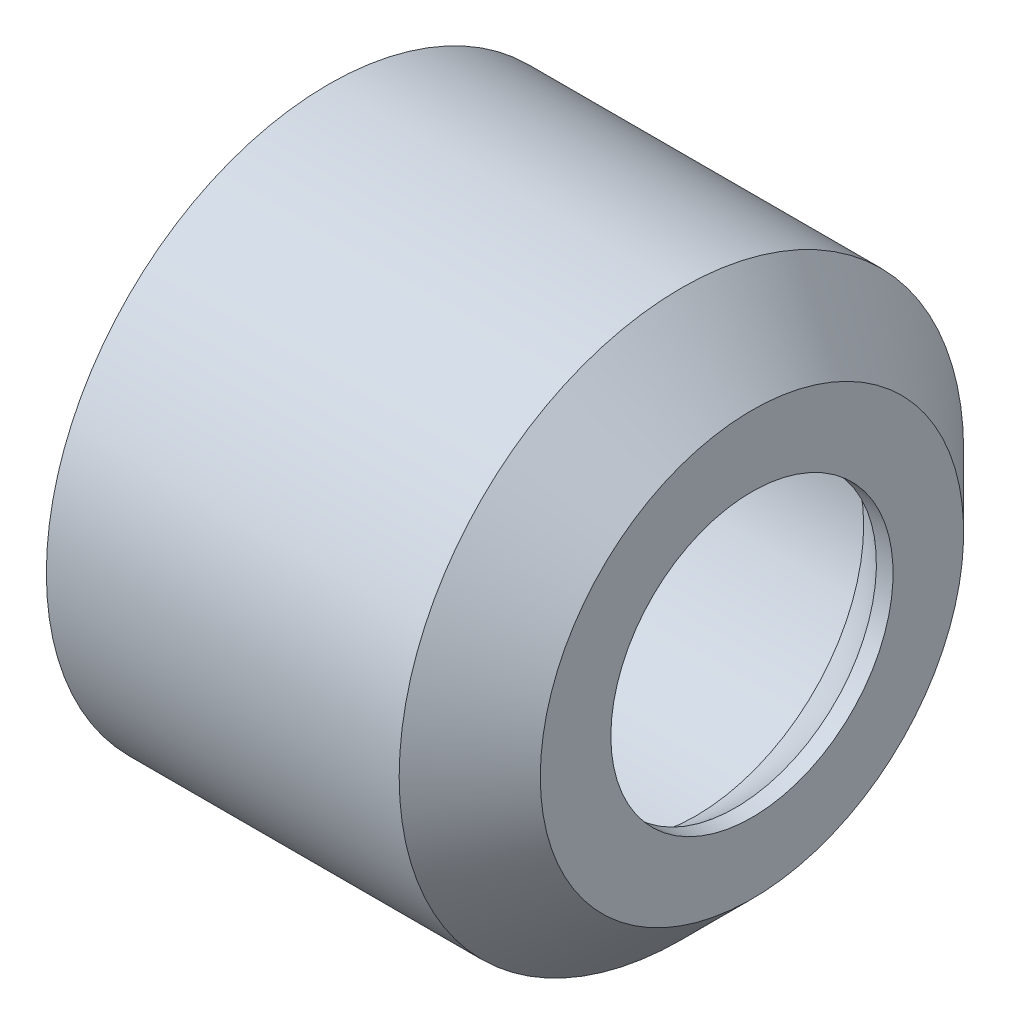
ISO-10303-21;
HEADER;
FILE_DESCRIPTION(('STEP AP214'),'2;1');
FILE_NAME('part.step','',(''),(''),'','','');
FILE_SCHEMA(('AUTOMOTIVE_DESIGN { 1 0 10303 214 1 1 1 1 }'));
ENDSEC;
DATA;
#1=APPLICATION_CONTEXT('core data for automotive mechanical design processes');
#2=APPLICATION_PROTOCOL_DEFINITION('international standard','automotive_design',2000,#1);
#3=PRODUCT_CONTEXT('',#1,'mechanical');
#4=PRODUCT('Part','Part','',(#3));
#5=PRODUCT_RELATED_PRODUCT_CATEGORY('part','',(#4));
#6=PRODUCT_DEFINITION_FORMATION('','',#4);
#7=PRODUCT_DEFINITION_CONTEXT('part definition',#1,'design');
#8=PRODUCT_DEFINITION('design','',#6,#7);
#9=PRODUCT_DEFINITION_SHAPE('','',#8);
#10=(LENGTH_UNIT() NAMED_UNIT(*) SI_UNIT(.MILLI.,.METRE.));
#11=(NAMED_UNIT(*) PLANE_ANGLE_UNIT() SI_UNIT($,.RADIAN.));
#12=(NAMED_UNIT(*) SI_UNIT($,.STERADIAN.) SOLID_ANGLE_UNIT());
#13=UNCERTAINTY_MEASURE_WITH_UNIT(LENGTH_MEASURE(1.E-05),#10,'distance_accuracy_value','');
#14=(GEOMETRIC_REPRESENTATION_CONTEXT(3) GLOBAL_UNCERTAINTY_ASSIGNED_CONTEXT((#13)) GLOBAL_UNIT_ASSIGNED_CONTEXT((#10,
#11,#12)) REPRESENTATION_CONTEXT('',''));
#15=CARTESIAN_POINT('',(0.,0.,0.));
#16=DIRECTION('',(0.,0.,1.));
#17=DIRECTION('',(1.,0.,0.));
#18=AXIS2_PLACEMENT_3D('',#15,#16,#17);
#19=CARTESIAN_POINT('',(0.,0.,0.));
#20=DIRECTION('',(-1.,0.,0.));
#21=DIRECTION('',(0.,0.,1.));
#22=AXIS2_PLACEMENT_3D('',#19,#20,#21);
#23=CYLINDRICAL_SURFACE('',#22,12.);
#24=CARTESIAN_POINT('',(17.7372509398496,0.,0.));
#25=DIRECTION('',(-1.,0.,0.));
#26=DIRECTION('',(0.,0.,1.));
#27=AXIS2_PLACEMENT_3D('',#24,#25,#26);
#28=CIRCLE('',#27,12.);
#29=CARTESIAN_POINT('',(17.7372509398496,0.,12.));
#30=VERTEX_POINT('',#29);
#31=EDGE_CURVE('E10',#30,#30,#28,.T.);
#32=ORIENTED_EDGE('',*,*,#31,.F.);
#33=EDGE_LOOP('',(#32));
#34=FACE_BOUND('',#33,.T.);
#35=CARTESIAN_POINT('',(32.7372509398496,0.,0.));
#36=DIRECTION('',(-1.,0.,0.));
#37=DIRECTION('',(0.,0.,1.));
#38=AXIS2_PLACEMENT_3D('',#35,#36,#37);
#39=CIRCLE('',#38,12.);
#40=CARTESIAN_POINT('',(32.7372509398496,0.,12.));
#41=VERTEX_POINT('',#40);
#42=EDGE_CURVE('E58',#41,#41,#39,.T.);
#43=ORIENTED_EDGE('',*,*,#42,.T.);
#44=EDGE_LOOP('',(#43));
#45=FACE_BOUND('',#44,.T.);
#46=ADVANCED_FACE('F30',(#34,#45),#23,.T.);
#47=CARTESIAN_POINT('',(17.7372509398496,9.,0.));
#48=DIRECTION('',(1.,0.,0.));
#49=DIRECTION('',(0.,0.,-1.));
#50=AXIS2_PLACEMENT_3D('',#47,#48,#49);
#51=PLANE('',#50);
#52=CARTESIAN_POINT('',(17.7372509398496,0.,0.));
#53=DIRECTION('',(-1.,0.,0.));
#54=DIRECTION('',(0.,0.,1.));
#55=AXIS2_PLACEMENT_3D('',#52,#53,#54);
#56=CIRCLE('',#55,9.);
#57=CARTESIAN_POINT('',(17.7372509398496,0.,9.));
#58=VERTEX_POINT('',#57);
#59=EDGE_CURVE('E36',#58,#58,#56,.T.);
#60=ORIENTED_EDGE('',*,*,#59,.F.);
#61=EDGE_LOOP('',(#60));
#62=FACE_BOUND('',#61,.T.);
#63=ORIENTED_EDGE('',*,*,#31,.T.);
#64=EDGE_LOOP('',(#63));
#65=FACE_BOUND('',#64,.T.);
#66=ADVANCED_FACE('F95',(#62,#65),#51,.F.);
#67=CARTESIAN_POINT('',(0.,0.,0.));
#68=DIRECTION('',(-1.,0.,0.));
#69=DIRECTION('',(0.,0.,1.));
#70=AXIS2_PLACEMENT_3D('',#67,#68,#69);
#71=CYLINDRICAL_SURFACE('',#70,9.);
#72=CARTESIAN_POINT('',(33.3467794508771,0.,0.));
#73=DIRECTION('',(-1.,0.,0.));
#74=DIRECTION('',(0.,0.,1.));
#75=AXIS2_PLACEMENT_3D('',#72,#73,#74);
#76=CIRCLE('',#75,9.);
#77=CARTESIAN_POINT('',(33.3467794508771,0.,9.));
#78=VERTEX_POINT('',#77);
#79=EDGE_CURVE('E40',#78,#78,#76,.T.);
#80=ORIENTED_EDGE('',*,*,#79,.F.);
#81=EDGE_LOOP('',(#80));
#82=FACE_BOUND('',#81,.T.);
#83=ORIENTED_EDGE('',*,*,#59,.T.);
#84=EDGE_LOOP('',(#83));
#85=FACE_BOUND('',#84,.T.);
#86=ADVANCED_FACE('F90',(#82,#85),#71,.F.);
#87=CARTESIAN_POINT('',(33.3467794508771,9.,0.));
#88=DIRECTION('',(1.,0.,0.));
#89=DIRECTION('',(0.,0.,-1.));
#90=AXIS2_PLACEMENT_3D('',#87,#88,#89);
#91=PLANE('',#90);
#92=CARTESIAN_POINT('',(33.3467794508771,0.,0.));
#93=DIRECTION('',(-1.,0.,0.));
#94=DIRECTION('',(0.,0.,1.));
#95=AXIS2_PLACEMENT_3D('',#92,#93,#94);
#96=CIRCLE('',#95,7.1394190189454);
#97=CARTESIAN_POINT('',(33.3467794508771,7.13941901894539,0.));
#98=VERTEX_POINT('',#97);
#99=EDGE_CURVE('E44',#98,#98,#96,.T.);
#100=ORIENTED_EDGE('',*,*,#99,.F.);
#101=EDGE_LOOP('',(#100));
#102=FACE_BOUND('',#101,.T.);
#103=ORIENTED_EDGE('',*,*,#79,.T.);
#104=EDGE_LOOP('',(#103));
#105=FACE_BOUND('',#104,.T.);
#106=ADVANCED_FACE('F84',(#102,#105),#91,.F.);
#107=CARTESIAN_POINT('',(29.7372509398496,0.,0.));
#108=DIRECTION('',(-1.,0.,0.));
#109=DIRECTION('',(0.,1.,0.));
#110=AXIS2_PLACEMENT_3D('',#107,#108,#109);
#111=SPHERICAL_SURFACE('',#110,8.);
#112=CARTESIAN_POINT('',(35.0287535619788,0.,0.));
#113=DIRECTION('',(-1.,0.,0.));
#114=DIRECTION('',(0.,0.,1.));
#115=AXIS2_PLACEMENT_3D('',#112,#113,#114);
#116=CIRCLE('',#115,6.);
#117=CARTESIAN_POINT('',(35.0287535619788,6.,0.));
#118=VERTEX_POINT('',#117);
#119=EDGE_CURVE('E49',#118,#118,#116,.T.);
#120=CARTESIAN_POINT('',(35.0287535619788,6.,0.));
#121=CARTESIAN_POINT('',(35.0128388929628,6.01403542136426,0.));
#122=CARTESIAN_POINT('',(34.9968683792028,6.02800752070068,0.));
#123=CARTESIAN_POINT('',(34.9648166789558,6.05582419698878,0.));
#124=CARTESIAN_POINT('',(34.9487354924688,6.06966877394046,0.));
#125=CARTESIAN_POINT('',(34.9164634635293,6.09722952713009,0.));
#126=CARTESIAN_POINT('',(34.9002726210767,6.11094570336802,0.));
#127=CARTESIAN_POINT('',(34.8677823057882,6.13824878709487,0.));
#128=CARTESIAN_POINT('',(34.8514828329523,6.15183569458379,0.));
#129=CARTESIAN_POINT('',(34.8187762888547,6.17887938038276,0.));
#130=CARTESIAN_POINT('',(34.802369217593,6.19233615869281,0.));
#131=CARTESIAN_POINT('',(34.7694485155491,6.21911873409917,0.));
#132=CARTESIAN_POINT('',(34.752934884767,6.23244453119547,0.));
#133=CARTESIAN_POINT('',(34.7198021092987,6.25896430039142,0.));
#134=CARTESIAN_POINT('',(34.7031829646126,6.27215827249106,0.));
#135=CARTESIAN_POINT('',(34.6698402136435,6.29841355626892,0.));
#136=CARTESIAN_POINT('',(34.6531166073606,6.31147486794713,0.));
#137=CARTESIAN_POINT('',(34.6195659921167,6.33746400385429,0.));
#138=CARTESIAN_POINT('',(34.6027389831558,6.35039182808323,0.));
#139=CARTESIAN_POINT('',(34.5689826280232,6.37611317051707,0.));
#140=CARTESIAN_POINT('',(34.5520532818514,6.38890668872196,0.));
#141=CARTESIAN_POINT('',(34.5180933242435,6.41435860903682,0.));
#142=CARTESIAN_POINT('',(34.5010627128074,6.42701701114679,0.));
#143=CARTESIAN_POINT('',(34.4669013030298,6.45219789775636,0.));
#144=CARTESIAN_POINT('',(34.4497705046882,6.46472038225596,0.));
#145=CARTESIAN_POINT('',(34.4154098058018,6.4896286407355,0.));
#146=CARTESIAN_POINT('',(34.3981799052571,6.50201441471544,0.));
#147=CARTESIAN_POINT('',(34.363622092942,6.52664846790271,0.));
#148=CARTESIAN_POINT('',(34.3462941811716,6.53889674711005,0.));
#149=CARTESIAN_POINT('',(34.3115414435885,6.56325503520517,0.));
#150=CARTESIAN_POINT('',(34.2941166177758,6.57536504409296,0.));
#151=CARTESIAN_POINT('',(34.2591711554282,6.59944602475719,0.));
#152=CARTESIAN_POINT('',(34.2416505188932,6.61141699653362,0.));
#153=CARTESIAN_POINT('',(34.2065145444874,6.63521914498699,0.));
#154=CARTESIAN_POINT('',(34.1888992066166,6.64705032166392,0.));
#155=CARTESIAN_POINT('',(34.1535749449221,6.67057213078179,0.));
#156=CARTESIAN_POINT('',(34.1358660210983,6.68226276322273,0.));
#157=CARTESIAN_POINT('',(34.1003557088067,6.70550274363125,0.));
#158=CARTESIAN_POINT('',(34.0825543203387,6.71705209159882,0.));
#159=CARTESIAN_POINT('',(34.0468602059219,6.74000877176919,0.));
#160=CARTESIAN_POINT('',(34.0289674799731,6.75141610397198,0.));
#161=CARTESIAN_POINT('',(33.9930918235415,6.77408803031364,0.));
#162=CARTESIAN_POINT('',(33.9751088930587,6.78535262445251,0.));
#163=CARTESIAN_POINT('',(33.9390539662175,6.8077383614052,0.));
#164=CARTESIAN_POINT('',(33.920981969859,6.81885950421903,0.));
#165=CARTESIAN_POINT('',(33.8847500555646,6.84095763434366,0.));
#166=CARTESIAN_POINT('',(33.8665901376287,6.85193462165447,0.));
#167=CARTESIAN_POINT('',(33.8301835300442,6.87374374572293,0.));
#168=CARTESIAN_POINT('',(33.8119368403957,6.88457588248058,0.));
#169=CARTESIAN_POINT('',(33.7753578447456,6.9060946195641,0.));
#170=CARTESIAN_POINT('',(33.757025538744,6.91678121988997,0.));
#171=CARTESIAN_POINT('',(33.7202764711683,6.93800820744744,0.));
#172=CARTESIAN_POINT('',(33.7018597095944,6.94854859467905,0.));
#173=CARTESIAN_POINT('',(33.6649428970008,6.96948248864004,0.));
#174=CARTESIAN_POINT('',(33.6464428459813,6.97987599536942,0.));
#175=CARTESIAN_POINT('',(33.6093606259038,7.00051547023145,0.));
#176=CARTESIAN_POINT('',(33.5907784568458,7.01076143836409,0.));
#177=CARTESIAN_POINT('',(33.5535331772733,7.0311051872311,0.));
#178=CARTESIAN_POINT('',(33.5348700667587,7.04120296796546,0.));
#179=CARTESIAN_POINT('',(33.4974640860737,7.06124970280024,0.));
#180=CARTESIAN_POINT('',(33.4787212159033,7.07119865690065,0.));
#181=CARTESIAN_POINT('',(33.4411569024064,7.09094710797314,0.));
#182=CARTESIAN_POINT('',(33.4223354590799,7.10074660494521,0.));
#183=CARTESIAN_POINT('',(33.3846151920581,7.12019552327628,0.));
#184=CARTESIAN_POINT('',(33.3657163683629,7.12984494463529,0.));
#185=CARTESIAN_POINT('',(33.3467794508771,7.13941901894539,0.));
#186=B_SPLINE_CURVE_WITH_KNOTS('',3,(#120,#121,#122,#123,#124,#125,#126,#127,#128,#129,#130,
#131,#132,#133,#134,#135,#136,#137,#138,#139,#140,#141,#142,#143,#144,#145,#146,#147,#148,#149,
#150,#151,#152,#153,#154,#155,#156,#157,#158,#159,#160,#161,#162,#163,#164,#165,#166,#167,#168,
#169,#170,#171,#172,#173,#174,#175,#176,#177,#178,#179,#180,#181,#182,#183,#184,#185),
.UNSPECIFIED.,.F.,.F.,(4,2,2,2,2,2,2,2,2,2,2,2,2,2,2,2,2,2,2,2,2,2,2,2,2,2,2,2,2,2,2,2,4),(0.,
0.0636585131477708,0.127317026295541,0.190975539443316,0.254634052591089,0.318292565738861,
0.381951078886631,0.445609592034403,0.509268105182178,0.572926618329951,0.636585131477722,
0.700243644625493,0.763902157773265,0.827560670921042,0.891219184068812,0.954877697216587,
1.01853621036436,1.08219472351213,1.1458532366599,1.20951174980767,1.27317026295544,
1.33682877610322,1.40048728925099,1.46414580239877,1.52780431554653,1.59146282869431,
1.65512134184208,1.71877985498985,1.78243836813763,1.8460968812854,1.90975539443317,
1.97341390758094,2.03707242072872),.UNSPECIFIED.);
#187=EDGE_CURVE('BSEAM78',#118,#98,#186,.T.);
#188=ORIENTED_EDGE('',*,*,#119,.F.);
#189=ORIENTED_EDGE('',*,*,#99,.T.);
#190=ORIENTED_EDGE('',*,*,#187,.T.);
#191=ORIENTED_EDGE('',*,*,#187,.F.);
#192=EDGE_LOOP('',(#188,#190,#189,#191));
#193=FACE_BOUND('',#192,.T.);
#194=ADVANCED_FACE('F78',(#193),#111,.F.);
#195=CARTESIAN_POINT('',(0.,0.,0.));
#196=DIRECTION('',(-1.,0.,0.));
#197=DIRECTION('',(0.,0.,1.));
#198=AXIS2_PLACEMENT_3D('',#195,#196,#197);
#199=CYLINDRICAL_SURFACE('',#198,6.);
#200=CARTESIAN_POINT('',(35.7372509398496,0.,0.));
#201=DIRECTION('',(-1.,0.,0.));
#202=DIRECTION('',(0.,0.,1.));
#203=AXIS2_PLACEMENT_3D('',#200,#201,#202);
#204=CIRCLE('',#203,6.);
#205=CARTESIAN_POINT('',(35.7372509398496,0.,6.));
#206=VERTEX_POINT('',#205);
#207=EDGE_CURVE('E52',#206,#206,#204,.T.);
#208=ORIENTED_EDGE('',*,*,#207,.F.);
#209=EDGE_LOOP('',(#208));
#210=FACE_BOUND('',#209,.T.);
#211=ORIENTED_EDGE('',*,*,#119,.T.);
#212=EDGE_LOOP('',(#211));
#213=FACE_BOUND('',#212,.T.);
#214=ADVANCED_FACE('F72',(#210,#213),#199,.F.);
#215=CARTESIAN_POINT('',(35.7372509398496,9.,0.));
#216=DIRECTION('',(-1.,0.,0.));
#217=DIRECTION('',(0.,0.,1.));
#218=AXIS2_PLACEMENT_3D('',#215,#216,#217);
#219=PLANE('',#218);
#220=CARTESIAN_POINT('',(35.7372509398496,0.,0.));
#221=DIRECTION('',(-1.,0.,0.));
#222=DIRECTION('',(0.,0.,1.));
#223=AXIS2_PLACEMENT_3D('',#220,#221,#222);
#224=CIRCLE('',#223,9.);
#225=CARTESIAN_POINT('',(35.7372509398496,0.,9.));
#226=VERTEX_POINT('',#225);
#227=EDGE_CURVE('E55',#226,#226,#224,.T.);
#228=ORIENTED_EDGE('',*,*,#227,.F.);
#229=EDGE_LOOP('',(#228));
#230=FACE_BOUND('',#229,.T.);
#231=ORIENTED_EDGE('',*,*,#207,.T.);
#232=EDGE_LOOP('',(#231));
#233=FACE_BOUND('',#232,.T.);
#234=ADVANCED_FACE('F66',(#230,#233),#219,.F.);
#235=CARTESIAN_POINT('',(35.7372509398496,0.,0.));
#236=DIRECTION('',(-1.,0.,0.));
#237=DIRECTION('',(0.,0.,1.));
#238=AXIS2_PLACEMENT_3D('',#235,#236,#237);
#239=CONICAL_SURFACE('',#238,9.,0.785398163397448);
#240=ORIENTED_EDGE('',*,*,#42,.F.);
#241=EDGE_LOOP('',(#240));
#242=FACE_BOUND('',#241,.T.);
#243=ORIENTED_EDGE('',*,*,#227,.T.);
#244=EDGE_LOOP('',(#243));
#245=FACE_BOUND('',#244,.T.);
#246=ADVANCED_FACE('F63',(#242,#245),#239,.T.);
#247=CLOSED_SHELL('',(#46,#66,#86,#106,#194,#214,#234,#246));
#248=MANIFOLD_SOLID_BREP('B2',#247);
#249=ADVANCED_BREP_SHAPE_REPRESENTATION('',(#18,#248),#14);
#250=SHAPE_DEFINITION_REPRESENTATION(#9,#249);
ENDSEC;
END-ISO-10303-21;
